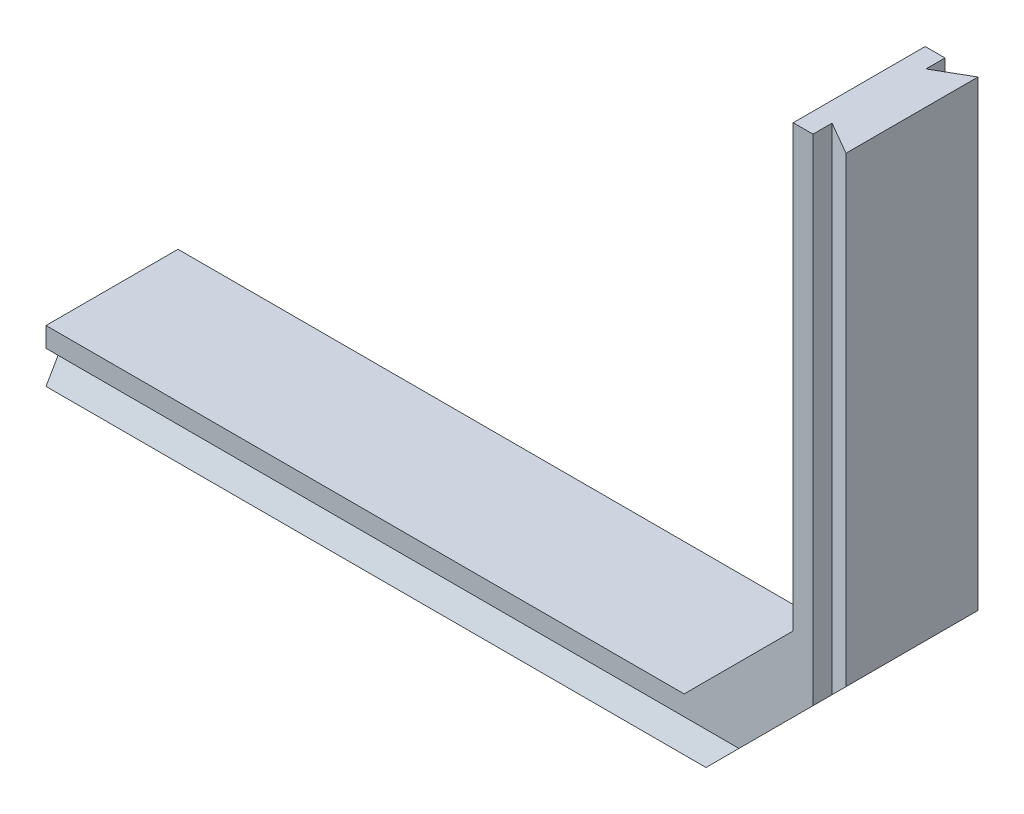
ISO-10303-21;
HEADER;
FILE_DESCRIPTION(('STEP AP214'),'2;1');
FILE_NAME('part.step','',(''),(''),'','','');
FILE_SCHEMA(('AUTOMOTIVE_DESIGN { 1 0 10303 214 1 1 1 1 }'));
ENDSEC;
DATA;
#1=APPLICATION_CONTEXT('core data for automotive mechanical design processes');
#2=APPLICATION_PROTOCOL_DEFINITION('international standard','automotive_design',2000,#1);
#3=PRODUCT_CONTEXT('',#1,'mechanical');
#4=PRODUCT('Part','Part','',(#3));
#5=PRODUCT_RELATED_PRODUCT_CATEGORY('part','',(#4));
#6=PRODUCT_DEFINITION_FORMATION('','',#4);
#7=PRODUCT_DEFINITION_CONTEXT('part definition',#1,'design');
#8=PRODUCT_DEFINITION('design','',#6,#7);
#9=PRODUCT_DEFINITION_SHAPE('','',#8);
#10=(LENGTH_UNIT() NAMED_UNIT(*) SI_UNIT(.MILLI.,.METRE.));
#11=(NAMED_UNIT(*) PLANE_ANGLE_UNIT() SI_UNIT($,.RADIAN.));
#12=(NAMED_UNIT(*) SI_UNIT($,.STERADIAN.) SOLID_ANGLE_UNIT());
#13=UNCERTAINTY_MEASURE_WITH_UNIT(LENGTH_MEASURE(1.E-05),#10,'distance_accuracy_value','');
#14=(GEOMETRIC_REPRESENTATION_CONTEXT(3) GLOBAL_UNCERTAINTY_ASSIGNED_CONTEXT((#13)) GLOBAL_UNIT_ASSIGNED_CONTEXT((#10,
#11,#12)) REPRESENTATION_CONTEXT('',''));
#15=CARTESIAN_POINT('',(0.,0.,0.));
#16=DIRECTION('',(0.,0.,1.));
#17=DIRECTION('',(1.,0.,0.));
#18=AXIS2_PLACEMENT_3D('',#15,#16,#17);
#19=CARTESIAN_POINT('',(96.6862915010152,0.,20.));
#20=DIRECTION('',(0.,-1.,0.));
#21=DIRECTION('',(1.,0.,0.));
#22=AXIS2_PLACEMENT_3D('',#19,#20,#21);
#23=PLANE('',#22);
#24=DIRECTION('',(-1.,0.,0.));
#25=VECTOR('',#24,1.);
#26=CARTESIAN_POINT('',(96.6862915010152,0.,0.));
#27=LINE('',#26,#25);
#28=CARTESIAN_POINT('',(96.6862915010152,0.,0.));
#29=VERTEX_POINT('',#28);
#30=CARTESIAN_POINT('',(0.,0.,0.));
#31=VERTEX_POINT('',#30);
#32=EDGE_CURVE('E231',#29,#31,#27,.T.);
#33=ORIENTED_EDGE('',*,*,#32,.T.);
#34=DIRECTION('',(0.,0.,-1.));
#35=VECTOR('',#34,1.);
#36=CARTESIAN_POINT('',(0.,0.,20.));
#37=LINE('',#36,#35);
#38=CARTESIAN_POINT('',(0.,0.,20.));
#39=VERTEX_POINT('',#38);
#40=EDGE_CURVE('E189',#39,#31,#37,.T.);
#41=ORIENTED_EDGE('',*,*,#40,.F.);
#42=DIRECTION('',(-1.,0.,0.));
#43=VECTOR('',#42,1.);
#44=CARTESIAN_POINT('',(96.6862915010152,0.,20.));
#45=LINE('',#44,#43);
#46=CARTESIAN_POINT('',(96.6862915010152,0.,20.));
#47=VERTEX_POINT('',#46);
#48=EDGE_CURVE('E248',#47,#39,#45,.T.);
#49=ORIENTED_EDGE('',*,*,#48,.F.);
#50=DIRECTION('',(0.,0.,-1.));
#51=VECTOR('',#50,1.);
#52=CARTESIAN_POINT('',(96.6862915010152,0.,20.));
#53=LINE('',#52,#51);
#54=EDGE_CURVE('E230',#47,#29,#53,.T.);
#55=ORIENTED_EDGE('',*,*,#54,.T.);
#56=EDGE_LOOP('',(#33,#41,#49,#55));
#57=FACE_BOUND('',#56,.T.);
#58=ADVANCED_FACE('F35',(#57),#23,.F.);
#59=CARTESIAN_POINT('',(0.,0.,20.));
#60=DIRECTION('',(1.,0.,0.));
#61=DIRECTION('',(0.,1.,0.));
#62=AXIS2_PLACEMENT_3D('',#59,#60,#61);
#63=PLANE('',#62);
#64=DIRECTION('',(0.,0.,-1.));
#65=VECTOR('',#64,1.);
#66=CARTESIAN_POINT('',(0.,-8.00000000000001,20.));
#67=LINE('',#66,#65);
#68=CARTESIAN_POINT('',(0.,-8.00000000000001,20.));
#69=VERTEX_POINT('',#68);
#70=CARTESIAN_POINT('',(0.,-8.00000000000001,0.));
#71=VERTEX_POINT('',#70);
#72=EDGE_CURVE('E186',#69,#71,#67,.T.);
#73=ORIENTED_EDGE('',*,*,#72,.F.);
#74=DIRECTION('',(0.,-0.86602540378444,0.499999999999998));
#75=VECTOR('',#74,1.);
#76=CARTESIAN_POINT('',(0.,-3.00000000000001,17.1132486540519));
#77=LINE('',#76,#75);
#78=CARTESIAN_POINT('',(0.,-3.00000000000001,17.1132486540519));
#79=VERTEX_POINT('',#78);
#80=EDGE_CURVE('E212',#79,#69,#77,.T.);
#81=ORIENTED_EDGE('',*,*,#80,.F.);
#82=DIRECTION('',(0.,0.,-1.));
#83=VECTOR('',#82,1.);
#84=CARTESIAN_POINT('',(0.,-3.00000000000001,20.));
#85=LINE('',#84,#83);
#86=CARTESIAN_POINT('',(0.,-3.00000000000001,20.));
#87=VERTEX_POINT('',#86);
#88=EDGE_CURVE('E288',#87,#79,#85,.T.);
#89=ORIENTED_EDGE('',*,*,#88,.F.);
#90=DIRECTION('',(0.,-1.,0.));
#91=VECTOR('',#90,1.);
#92=CARTESIAN_POINT('',(0.,0.,20.));
#93=LINE('',#92,#91);
#94=EDGE_CURVE('E221',#39,#87,#93,.T.);
#95=ORIENTED_EDGE('',*,*,#94,.F.);
#96=ORIENTED_EDGE('',*,*,#40,.T.);
#97=DIRECTION('',(0.,-1.,0.));
#98=VECTOR('',#97,1.);
#99=CARTESIAN_POINT('',(0.,0.,0.));
#100=LINE('',#99,#98);
#101=CARTESIAN_POINT('',(0.,-3.00000000000001,0.));
#102=VERTEX_POINT('',#101);
#103=EDGE_CURVE('E234',#31,#102,#100,.T.);
#104=ORIENTED_EDGE('',*,*,#103,.T.);
#105=DIRECTION('',(0.,0.,-1.));
#106=VECTOR('',#105,1.);
#107=CARTESIAN_POINT('',(0.,-3.00000000000001,0.));
#108=LINE('',#107,#106);
#109=CARTESIAN_POINT('',(0.,-3.00000000000001,2.88675134594811));
#110=VERTEX_POINT('',#109);
#111=EDGE_CURVE('E277',#110,#102,#108,.T.);
#112=ORIENTED_EDGE('',*,*,#111,.F.);
#113=DIRECTION('',(0.,0.86602540378444,0.499999999999998));
#114=VECTOR('',#113,1.);
#115=CARTESIAN_POINT('',(0.,-3.00000000000001,2.88675134594811));
#116=LINE('',#115,#114);
#117=EDGE_CURVE('E279',#71,#110,#116,.T.);
#118=ORIENTED_EDGE('',*,*,#117,.F.);
#119=EDGE_LOOP('',(#73,#81,#89,#95,#96,#104,#112,#118));
#120=FACE_BOUND('',#119,.T.);
#121=ADVANCED_FACE('F313',(#120),#63,.F.);
#122=CARTESIAN_POINT('',(0.,-8.00000000000001,20.));
#123=DIRECTION('',(0.,1.,0.));
#124=DIRECTION('',(0.,0.,1.));
#125=AXIS2_PLACEMENT_3D('',#122,#123,#124);
#126=PLANE('',#125);
#127=DIRECTION('',(1.,0.,0.));
#128=VECTOR('',#127,1.);
#129=CARTESIAN_POINT('',(0.,-8.00000000000001,0.));
#130=LINE('',#129,#128);
#131=CARTESIAN_POINT('',(100.,-8.00000000000001,0.));
#132=VERTEX_POINT('',#131);
#133=EDGE_CURVE('E238',#71,#132,#130,.T.);
#134=ORIENTED_EDGE('',*,*,#133,.T.);
#135=DIRECTION('',(0.,0.,-1.));
#136=VECTOR('',#135,1.);
#137=CARTESIAN_POINT('',(100.,-8.00000000000001,20.));
#138=LINE('',#137,#136);
#139=CARTESIAN_POINT('',(100.,-8.,20.));
#140=VERTEX_POINT('',#139);
#141=EDGE_CURVE('E177',#140,#132,#138,.T.);
#142=ORIENTED_EDGE('',*,*,#141,.F.);
#143=DIRECTION('',(1.,0.,0.));
#144=VECTOR('',#143,1.);
#145=CARTESIAN_POINT('',(0.,-8.00000000000001,20.));
#146=LINE('',#145,#144);
#147=EDGE_CURVE('E217',#69,#140,#146,.T.);
#148=ORIENTED_EDGE('',*,*,#147,.F.);
#149=ORIENTED_EDGE('',*,*,#72,.T.);
#150=EDGE_LOOP('',(#134,#142,#148,#149));
#151=FACE_BOUND('',#150,.T.);
#152=ADVANCED_FACE('F321',(#151),#126,.F.);
#153=CARTESIAN_POINT('',(100.,-8.00000000000001,20.));
#154=DIRECTION('',(-0.707106781186549,0.707106781186546,0.));
#155=DIRECTION('',(-0.707106781186546,-0.707106781186549,0.));
#156=AXIS2_PLACEMENT_3D('',#153,#154,#155);
#157=PLANE('',#156);
#158=DIRECTION('',(0.,0.,1.));
#159=VECTOR('',#158,1.);
#160=CARTESIAN_POINT('',(116.213203435596,8.21320343559641,20.));
#161=LINE('',#160,#159);
#162=CARTESIAN_POINT('',(116.213203435596,8.21320343559642,0.));
#163=VERTEX_POINT('',#162);
#164=CARTESIAN_POINT('',(116.213203435596,8.21320343559641,2.88675134594816));
#165=VERTEX_POINT('',#164);
#166=EDGE_CURVE('E49',#163,#165,#161,.T.);
#167=ORIENTED_EDGE('',*,*,#166,.T.);
#168=DIRECTION('',(0.654653670707975,0.654653670707978,-0.37796447300923));
#169=VECTOR('',#168,1.);
#170=CARTESIAN_POINT('',(98.0817410406027,-9.91825895939731,13.3549560404994));
#171=LINE('',#170,#169);
#172=CARTESIAN_POINT('',(121.213203435596,13.2132034355964,0.));
#173=VERTEX_POINT('',#172);
#174=EDGE_CURVE('E297',#165,#173,#171,.T.);
#175=ORIENTED_EDGE('',*,*,#174,.T.);
#176=DIRECTION('',(0.,0.,-1.));
#177=VECTOR('',#176,1.);
#178=CARTESIAN_POINT('',(121.213203435596,13.2132034355965,20.));
#179=LINE('',#178,#177);
#180=CARTESIAN_POINT('',(121.213203435596,13.2132034355965,20.));
#181=VERTEX_POINT('',#180);
#182=EDGE_CURVE('E166',#181,#173,#179,.T.);
#183=ORIENTED_EDGE('',*,*,#182,.F.);
#184=DIRECTION('',(-0.654653670707975,-0.654653670707978,-0.37796447300923));
#185=VECTOR('',#184,1.);
#186=CARTESIAN_POINT('',(103.030457633657,-4.96954236634333,9.50218681664347));
#187=LINE('',#186,#185);
#188=CARTESIAN_POINT('',(116.213203435596,8.21320343559642,17.1132486540518));
#189=VERTEX_POINT('',#188);
#190=EDGE_CURVE('E211',#181,#189,#187,.T.);
#191=ORIENTED_EDGE('',*,*,#190,.T.);
#192=DIRECTION('',(0.,0.,1.));
#193=VECTOR('',#192,1.);
#194=CARTESIAN_POINT('',(116.213203435596,8.21320343559641,20.));
#195=LINE('',#194,#193);
#196=CARTESIAN_POINT('',(116.213203435596,8.21320343559642,20.));
#197=VERTEX_POINT('',#196);
#198=EDGE_CURVE('E200',#189,#197,#195,.T.);
#199=ORIENTED_EDGE('',*,*,#198,.T.);
#200=DIRECTION('',(0.707106781186546,0.707106781186549,0.));
#201=VECTOR('',#200,1.);
#202=CARTESIAN_POINT('',(100.,-8.00000000000001,20.));
#203=LINE('',#202,#201);
#204=CARTESIAN_POINT('',(105.,-3.,20.));
#205=VERTEX_POINT('',#204);
#206=EDGE_CURVE('E210',#205,#197,#203,.T.);
#207=ORIENTED_EDGE('',*,*,#206,.F.);
#208=DIRECTION('',(0.,0.,-1.));
#209=VECTOR('',#208,1.);
#210=CARTESIAN_POINT('',(105.,-3.,20.));
#211=LINE('',#210,#209);
#212=CARTESIAN_POINT('',(105.,-3.,17.1132486540519));
#213=VERTEX_POINT('',#212);
#214=EDGE_CURVE('E56',#205,#213,#211,.T.);
#215=ORIENTED_EDGE('',*,*,#214,.T.);
#216=DIRECTION('',(-0.654653670707976,-0.654653670707979,0.377964473009226));
#217=VECTOR('',#216,1.);
#218=CARTESIAN_POINT('',(100.,-8.00000000000001,20.));
#219=LINE('',#218,#217);
#220=EDGE_CURVE('E282',#213,#140,#219,.T.);
#221=ORIENTED_EDGE('',*,*,#220,.T.);
#222=ORIENTED_EDGE('',*,*,#141,.T.);
#223=DIRECTION('',(0.654653670707976,0.654653670707979,0.377964473009226));
#224=VECTOR('',#223,1.);
#225=CARTESIAN_POINT('',(104.948716593054,-3.05128340694608,2.85714285714283));
#226=LINE('',#225,#224);
#227=CARTESIAN_POINT('',(105.,-3.,2.88675134594811));
#228=VERTEX_POINT('',#227);
#229=EDGE_CURVE('E272',#132,#228,#226,.T.);
#230=ORIENTED_EDGE('',*,*,#229,.T.);
#231=DIRECTION('',(0.,0.,-1.));
#232=VECTOR('',#231,1.);
#233=CARTESIAN_POINT('',(105.,-2.99999999999999,20.));
#234=LINE('',#233,#232);
#235=CARTESIAN_POINT('',(105.,-3.,0.));
#236=VERTEX_POINT('',#235);
#237=EDGE_CURVE('E235',#228,#236,#234,.T.);
#238=ORIENTED_EDGE('',*,*,#237,.T.);
#239=DIRECTION('',(0.707106781186546,0.707106781186549,0.));
#240=VECTOR('',#239,1.);
#241=CARTESIAN_POINT('',(100.,-8.00000000000001,0.));
#242=LINE('',#241,#240);
#243=EDGE_CURVE('E168',#236,#163,#242,.T.);
#244=ORIENTED_EDGE('',*,*,#243,.T.);
#245=EDGE_LOOP('',(#167,#175,#183,#191,#199,#207,#215,#221,#222,#230,#238,#244));
#246=FACE_BOUND('',#245,.T.);
#247=ADVANCED_FACE('F209',(#246),#157,.F.);
#248=CARTESIAN_POINT('',(121.213203435596,13.2132034355965,20.));
#249=DIRECTION('',(-1.,0.,0.));
#250=DIRECTION('',(0.,-1.,0.));
#251=AXIS2_PLACEMENT_3D('',#248,#249,#250);
#252=PLANE('',#251);
#253=DIRECTION('',(0.,1.,0.));
#254=VECTOR('',#253,1.);
#255=CARTESIAN_POINT('',(121.213203435596,13.2132034355965,0.));
#256=LINE('',#255,#254);
#257=CARTESIAN_POINT('',(121.213203435596,83.2132034355965,0.));
#258=VERTEX_POINT('',#257);
#259=EDGE_CURVE('E150',#173,#258,#256,.T.);
#260=ORIENTED_EDGE('',*,*,#259,.T.);
#261=DIRECTION('',(0.,0.,-1.));
#262=VECTOR('',#261,1.);
#263=CARTESIAN_POINT('',(121.213203435596,83.2132034355965,20.));
#264=LINE('',#263,#262);
#265=CARTESIAN_POINT('',(121.213203435596,83.2132034355965,20.));
#266=VERTEX_POINT('',#265);
#267=EDGE_CURVE('E164',#266,#258,#264,.T.);
#268=ORIENTED_EDGE('',*,*,#267,.F.);
#269=DIRECTION('',(0.,1.,0.));
#270=VECTOR('',#269,1.);
#271=CARTESIAN_POINT('',(121.213203435596,13.2132034355965,20.));
#272=LINE('',#271,#270);
#273=EDGE_CURVE('E216',#181,#266,#272,.T.);
#274=ORIENTED_EDGE('',*,*,#273,.F.);
#275=ORIENTED_EDGE('',*,*,#182,.T.);
#276=EDGE_LOOP('',(#260,#268,#274,#275));
#277=FACE_BOUND('',#276,.T.);
#278=ADVANCED_FACE('F162',(#277),#252,.F.);
#279=CARTESIAN_POINT('',(121.213203435596,83.2132034355965,20.));
#280=DIRECTION('',(0.,-1.,0.));
#281=DIRECTION('',(0.,0.,-1.));
#282=AXIS2_PLACEMENT_3D('',#279,#280,#281);
#283=PLANE('',#282);
#284=ORIENTED_EDGE('',*,*,#267,.T.);
#285=DIRECTION('',(0.866025403784436,0.,-0.500000000000004));
#286=VECTOR('',#285,1.);
#287=CARTESIAN_POINT('',(116.213203435596,83.2132034355965,2.88675134594816));
#288=LINE('',#287,#286);
#289=CARTESIAN_POINT('',(116.213203435596,83.2132034355965,2.88675134594816));
#290=VERTEX_POINT('',#289);
#291=EDGE_CURVE('E147',#290,#258,#288,.T.);
#292=ORIENTED_EDGE('',*,*,#291,.F.);
#293=DIRECTION('',(0.,0.,1.));
#294=VECTOR('',#293,1.);
#295=CARTESIAN_POINT('',(116.213203435596,83.2132034355965,0.));
#296=LINE('',#295,#294);
#297=CARTESIAN_POINT('',(116.213203435596,83.2132034355965,0.));
#298=VERTEX_POINT('',#297);
#299=EDGE_CURVE('E157',#298,#290,#296,.T.);
#300=ORIENTED_EDGE('',*,*,#299,.F.);
#301=DIRECTION('',(-1.,0.,0.));
#302=VECTOR('',#301,1.);
#303=CARTESIAN_POINT('',(121.213203435596,83.2132034355965,0.));
#304=LINE('',#303,#302);
#305=CARTESIAN_POINT('',(113.213203435596,83.2132034355965,0.));
#306=VERTEX_POINT('',#305);
#307=EDGE_CURVE('E167',#298,#306,#304,.T.);
#308=ORIENTED_EDGE('',*,*,#307,.T.);
#309=DIRECTION('',(0.,0.,-1.));
#310=VECTOR('',#309,1.);
#311=CARTESIAN_POINT('',(113.213203435596,83.2132034355965,20.));
#312=LINE('',#311,#310);
#313=CARTESIAN_POINT('',(113.213203435596,83.2132034355965,20.));
#314=VERTEX_POINT('',#313);
#315=EDGE_CURVE('E175',#314,#306,#312,.T.);
#316=ORIENTED_EDGE('',*,*,#315,.F.);
#317=DIRECTION('',(-1.,0.,0.));
#318=VECTOR('',#317,1.);
#319=CARTESIAN_POINT('',(121.213203435596,83.2132034355965,20.));
#320=LINE('',#319,#318);
#321=CARTESIAN_POINT('',(116.213203435596,83.2132034355965,20.));
#322=VERTEX_POINT('',#321);
#323=EDGE_CURVE('E219',#322,#314,#320,.T.);
#324=ORIENTED_EDGE('',*,*,#323,.F.);
#325=DIRECTION('',(0.,0.,1.));
#326=VECTOR('',#325,1.);
#327=CARTESIAN_POINT('',(116.213203435596,83.2132034355965,20.));
#328=LINE('',#327,#326);
#329=CARTESIAN_POINT('',(116.213203435596,83.2132034355965,17.1132486540518));
#330=VERTEX_POINT('',#329);
#331=EDGE_CURVE('E202',#330,#322,#328,.T.);
#332=ORIENTED_EDGE('',*,*,#331,.F.);
#333=DIRECTION('',(-0.866025403784436,0.,-0.500000000000004));
#334=VECTOR('',#333,1.);
#335=CARTESIAN_POINT('',(116.213203435596,83.2132034355965,17.1132486540518));
#336=LINE('',#335,#334);
#337=EDGE_CURVE('E174',#266,#330,#336,.T.);
#338=ORIENTED_EDGE('',*,*,#337,.F.);
#339=EDGE_LOOP('',(#284,#292,#300,#308,#316,#324,#332,#338));
#340=FACE_BOUND('',#339,.T.);
#341=ADVANCED_FACE('F171',(#340),#283,.F.);
#342=CARTESIAN_POINT('',(113.213203435596,83.2132034355965,20.));
#343=DIRECTION('',(1.,0.,0.));
#344=DIRECTION('',(0.,1.,0.));
#345=AXIS2_PLACEMENT_3D('',#342,#343,#344);
#346=PLANE('',#345);
#347=DIRECTION('',(0.,-1.,0.));
#348=VECTOR('',#347,1.);
#349=CARTESIAN_POINT('',(113.213203435596,83.2132034355965,0.));
#350=LINE('',#349,#348);
#351=CARTESIAN_POINT('',(113.213203435596,16.5269119345812,0.));
#352=VERTEX_POINT('',#351);
#353=EDGE_CURVE('E244',#306,#352,#350,.T.);
#354=ORIENTED_EDGE('',*,*,#353,.T.);
#355=DIRECTION('',(0.,0.,-1.));
#356=VECTOR('',#355,1.);
#357=CARTESIAN_POINT('',(113.213203435596,16.5269119345812,20.));
#358=LINE('',#357,#356);
#359=CARTESIAN_POINT('',(113.213203435596,16.5269119345812,20.));
#360=VERTEX_POINT('',#359);
#361=EDGE_CURVE('E180',#360,#352,#358,.T.);
#362=ORIENTED_EDGE('',*,*,#361,.F.);
#363=DIRECTION('',(0.,-1.,0.));
#364=VECTOR('',#363,1.);
#365=CARTESIAN_POINT('',(113.213203435596,83.2132034355965,20.));
#366=LINE('',#365,#364);
#367=EDGE_CURVE('E226',#314,#360,#366,.T.);
#368=ORIENTED_EDGE('',*,*,#367,.F.);
#369=ORIENTED_EDGE('',*,*,#315,.T.);
#370=EDGE_LOOP('',(#354,#362,#368,#369));
#371=FACE_BOUND('',#370,.T.);
#372=ADVANCED_FACE('F348',(#371),#346,.F.);
#373=CARTESIAN_POINT('',(113.213203435596,16.5269119345812,20.));
#374=DIRECTION('',(0.707106781186549,-0.707106781186546,0.));
#375=DIRECTION('',(0.707106781186546,0.707106781186549,0.));
#376=AXIS2_PLACEMENT_3D('',#373,#374,#375);
#377=PLANE('',#376);
#378=DIRECTION('',(-0.707106781186546,-0.707106781186549,0.));
#379=VECTOR('',#378,1.);
#380=CARTESIAN_POINT('',(113.213203435596,16.5269119345812,0.));
#381=LINE('',#380,#379);
#382=EDGE_CURVE('E246',#352,#29,#381,.T.);
#383=ORIENTED_EDGE('',*,*,#382,.T.);
#384=ORIENTED_EDGE('',*,*,#54,.F.);
#385=DIRECTION('',(-0.707106781186546,-0.707106781186549,0.));
#386=VECTOR('',#385,1.);
#387=CARTESIAN_POINT('',(113.213203435596,16.5269119345812,20.));
#388=LINE('',#387,#386);
#389=EDGE_CURVE('E228',#360,#47,#388,.T.);
#390=ORIENTED_EDGE('',*,*,#389,.F.);
#391=ORIENTED_EDGE('',*,*,#361,.T.);
#392=EDGE_LOOP('',(#383,#384,#390,#391));
#393=FACE_BOUND('',#392,.T.);
#394=ADVANCED_FACE('F255',(#393),#377,.F.);
#395=CARTESIAN_POINT('',(0.,0.,20.));
#396=DIRECTION('',(0.,0.,1.));
#397=DIRECTION('',(1.,0.,0.));
#398=AXIS2_PLACEMENT_3D('',#395,#396,#397);
#399=PLANE('',#398);
#400=DIRECTION('',(0.,-1.,0.));
#401=VECTOR('',#400,1.);
#402=CARTESIAN_POINT('',(116.213203435596,0.,20.));
#403=LINE('',#402,#401);
#404=EDGE_CURVE('E42',#322,#197,#403,.T.);
#405=ORIENTED_EDGE('',*,*,#404,.F.);
#406=ORIENTED_EDGE('',*,*,#323,.T.);
#407=ORIENTED_EDGE('',*,*,#367,.T.);
#408=ORIENTED_EDGE('',*,*,#389,.T.);
#409=ORIENTED_EDGE('',*,*,#48,.T.);
#410=ORIENTED_EDGE('',*,*,#94,.T.);
#411=DIRECTION('',(-1.,0.,0.));
#412=VECTOR('',#411,1.);
#413=CARTESIAN_POINT('',(0.,-3.00000000000001,20.));
#414=LINE('',#413,#412);
#415=EDGE_CURVE('E195',#205,#87,#414,.T.);
#416=ORIENTED_EDGE('',*,*,#415,.F.);
#417=ORIENTED_EDGE('',*,*,#206,.T.);
#418=EDGE_LOOP('',(#405,#406,#407,#408,#409,#410,#416,#417));
#419=FACE_BOUND('',#418,.T.);
#420=ADVANCED_FACE('F214',(#419),#399,.T.);
#421=CARTESIAN_POINT('',(0.,0.,0.));
#422=DIRECTION('',(0.,0.,1.));
#423=DIRECTION('',(1.,0.,0.));
#424=AXIS2_PLACEMENT_3D('',#421,#422,#423);
#425=PLANE('',#424);
#426=ORIENTED_EDGE('',*,*,#307,.F.);
#427=DIRECTION('',(0.,-1.,0.));
#428=VECTOR('',#427,1.);
#429=CARTESIAN_POINT('',(116.213203435596,0.,0.));
#430=LINE('',#429,#428);
#431=EDGE_CURVE('E11',#298,#163,#430,.T.);
#432=ORIENTED_EDGE('',*,*,#431,.T.);
#433=ORIENTED_EDGE('',*,*,#243,.F.);
#434=DIRECTION('',(-1.,0.,0.));
#435=VECTOR('',#434,1.);
#436=CARTESIAN_POINT('',(0.,-3.00000000000001,0.));
#437=LINE('',#436,#435);
#438=EDGE_CURVE('E192',#236,#102,#437,.T.);
#439=ORIENTED_EDGE('',*,*,#438,.T.);
#440=ORIENTED_EDGE('',*,*,#103,.F.);
#441=ORIENTED_EDGE('',*,*,#32,.F.);
#442=ORIENTED_EDGE('',*,*,#382,.F.);
#443=ORIENTED_EDGE('',*,*,#353,.F.);
#444=EDGE_LOOP('',(#426,#432,#433,#439,#440,#441,#442,#443));
#445=FACE_BOUND('',#444,.T.);
#446=ADVANCED_FACE('F263',(#445),#425,.F.);
#447=CARTESIAN_POINT('',(121.213203435596,-3.,0.));
#448=DIRECTION('',(0.,1.,0.));
#449=DIRECTION('',(0.,0.,1.));
#450=AXIS2_PLACEMENT_3D('',#447,#448,#449);
#451=PLANE('',#450);
#452=DIRECTION('',(-1.,0.,0.));
#453=VECTOR('',#452,1.);
#454=CARTESIAN_POINT('',(121.213203435596,-3.,2.88675134594811));
#455=LINE('',#454,#453);
#456=EDGE_CURVE('E275',#228,#110,#455,.T.);
#457=ORIENTED_EDGE('',*,*,#456,.T.);
#458=ORIENTED_EDGE('',*,*,#111,.T.);
#459=ORIENTED_EDGE('',*,*,#438,.F.);
#460=ORIENTED_EDGE('',*,*,#237,.F.);
#461=EDGE_LOOP('',(#457,#458,#459,#460));
#462=FACE_BOUND('',#461,.T.);
#463=ADVANCED_FACE('F306',(#462),#451,.F.);
#464=CARTESIAN_POINT('',(121.213203435596,-3.,2.88675134594811));
#465=DIRECTION('',(0.,-0.499999999999998,0.86602540378444));
#466=DIRECTION('',(0.,-0.86602540378444,-0.499999999999998));
#467=AXIS2_PLACEMENT_3D('',#464,#465,#466);
#468=PLANE('',#467);
#469=ORIENTED_EDGE('',*,*,#133,.F.);
#470=ORIENTED_EDGE('',*,*,#117,.T.);
#471=ORIENTED_EDGE('',*,*,#456,.F.);
#472=ORIENTED_EDGE('',*,*,#229,.F.);
#473=EDGE_LOOP('',(#469,#470,#471,#472));
#474=FACE_BOUND('',#473,.T.);
#475=ADVANCED_FACE('F308',(#474),#468,.F.);
#476=CARTESIAN_POINT('',(121.213203435596,-3.,17.1132486540519));
#477=DIRECTION('',(0.,-0.499999999999998,-0.86602540378444));
#478=DIRECTION('',(0.,0.86602540378444,-0.499999999999998));
#479=AXIS2_PLACEMENT_3D('',#476,#477,#478);
#480=PLANE('',#479);
#481=DIRECTION('',(-1.,0.,0.));
#482=VECTOR('',#481,1.);
#483=CARTESIAN_POINT('',(121.213203435596,-3.,17.1132486540519));
#484=LINE('',#483,#482);
#485=EDGE_CURVE('E286',#213,#79,#484,.T.);
#486=ORIENTED_EDGE('',*,*,#485,.T.);
#487=ORIENTED_EDGE('',*,*,#80,.T.);
#488=ORIENTED_EDGE('',*,*,#147,.T.);
#489=ORIENTED_EDGE('',*,*,#220,.F.);
#490=EDGE_LOOP('',(#486,#487,#488,#489));
#491=FACE_BOUND('',#490,.T.);
#492=ADVANCED_FACE('F322',(#491),#480,.F.);
#493=CARTESIAN_POINT('',(121.213203435596,-3.,20.));
#494=DIRECTION('',(0.,1.,0.));
#495=DIRECTION('',(-1.,0.,0.));
#496=AXIS2_PLACEMENT_3D('',#493,#494,#495);
#497=PLANE('',#496);
#498=ORIENTED_EDGE('',*,*,#415,.T.);
#499=ORIENTED_EDGE('',*,*,#88,.T.);
#500=ORIENTED_EDGE('',*,*,#485,.F.);
#501=ORIENTED_EDGE('',*,*,#214,.F.);
#502=EDGE_LOOP('',(#498,#499,#500,#501));
#503=FACE_BOUND('',#502,.T.);
#504=ADVANCED_FACE('F316',(#503),#497,.F.);
#505=CARTESIAN_POINT('',(116.213203435596,-8.00000000000001,20.));
#506=DIRECTION('',(-1.,0.,0.));
#507=DIRECTION('',(0.,0.,1.));
#508=AXIS2_PLACEMENT_3D('',#505,#506,#507);
#509=PLANE('',#508);
#510=DIRECTION('',(0.,1.,0.));
#511=VECTOR('',#510,1.);
#512=CARTESIAN_POINT('',(116.213203435596,-8.00000000000001,17.1132486540518));
#513=LINE('',#512,#511);
#514=EDGE_CURVE('E293',#189,#330,#513,.T.);
#515=ORIENTED_EDGE('',*,*,#514,.T.);
#516=ORIENTED_EDGE('',*,*,#331,.T.);
#517=ORIENTED_EDGE('',*,*,#404,.T.);
#518=ORIENTED_EDGE('',*,*,#198,.F.);
#519=EDGE_LOOP('',(#515,#516,#517,#518));
#520=FACE_BOUND('',#519,.T.);
#521=ADVANCED_FACE('F199',(#520),#509,.F.);
#522=CARTESIAN_POINT('',(116.213203435596,-8.00000000000001,17.1132486540518));
#523=DIRECTION('',(0.500000000000004,0.,-0.866025403784436));
#524=DIRECTION('',(-0.866025403784436,0.,-0.500000000000004));
#525=AXIS2_PLACEMENT_3D('',#522,#523,#524);
#526=PLANE('',#525);
#527=ORIENTED_EDGE('',*,*,#273,.T.);
#528=ORIENTED_EDGE('',*,*,#337,.T.);
#529=ORIENTED_EDGE('',*,*,#514,.F.);
#530=ORIENTED_EDGE('',*,*,#190,.F.);
#531=EDGE_LOOP('',(#527,#528,#529,#530));
#532=FACE_BOUND('',#531,.T.);
#533=ADVANCED_FACE('F403',(#532),#526,.F.);
#534=CARTESIAN_POINT('',(116.213203435596,-8.00000000000001,2.88675134594816));
#535=DIRECTION('',(0.500000000000004,0.,0.866025403784436));
#536=DIRECTION('',(0.866025403784436,0.,-0.500000000000004));
#537=AXIS2_PLACEMENT_3D('',#534,#535,#536);
#538=PLANE('',#537);
#539=DIRECTION('',(0.,1.,0.));
#540=VECTOR('',#539,1.);
#541=CARTESIAN_POINT('',(116.213203435596,-8.00000000000001,2.88675134594816));
#542=LINE('',#541,#540);
#543=EDGE_CURVE('E152',#165,#290,#542,.T.);
#544=ORIENTED_EDGE('',*,*,#543,.T.);
#545=ORIENTED_EDGE('',*,*,#291,.T.);
#546=ORIENTED_EDGE('',*,*,#259,.F.);
#547=ORIENTED_EDGE('',*,*,#174,.F.);
#548=EDGE_LOOP('',(#544,#545,#546,#547));
#549=FACE_BOUND('',#548,.T.);
#550=ADVANCED_FACE('F149',(#549),#538,.F.);
#551=CARTESIAN_POINT('',(116.213203435596,-8.00000000000001,0.));
#552=DIRECTION('',(-1.,0.,0.));
#553=DIRECTION('',(0.,0.,1.));
#554=AXIS2_PLACEMENT_3D('',#551,#552,#553);
#555=PLANE('',#554);
#556=ORIENTED_EDGE('',*,*,#431,.F.);
#557=ORIENTED_EDGE('',*,*,#299,.T.);
#558=ORIENTED_EDGE('',*,*,#543,.F.);
#559=ORIENTED_EDGE('',*,*,#166,.F.);
#560=EDGE_LOOP('',(#556,#557,#558,#559));
#561=FACE_BOUND('',#560,.T.);
#562=ADVANCED_FACE('F301',(#561),#555,.F.);
#563=CLOSED_SHELL('',(#58,#121,#152,#247,#278,#341,#372,#394,#420,#446,#463,#475,#492,#504,#521,
#533,#550,#562));
#564=MANIFOLD_SOLID_BREP('B2',#563);
#565=ADVANCED_BREP_SHAPE_REPRESENTATION('',(#18,#564),#14);
#566=SHAPE_DEFINITION_REPRESENTATION(#9,#565);
ENDSEC;
END-ISO-10303-21;
